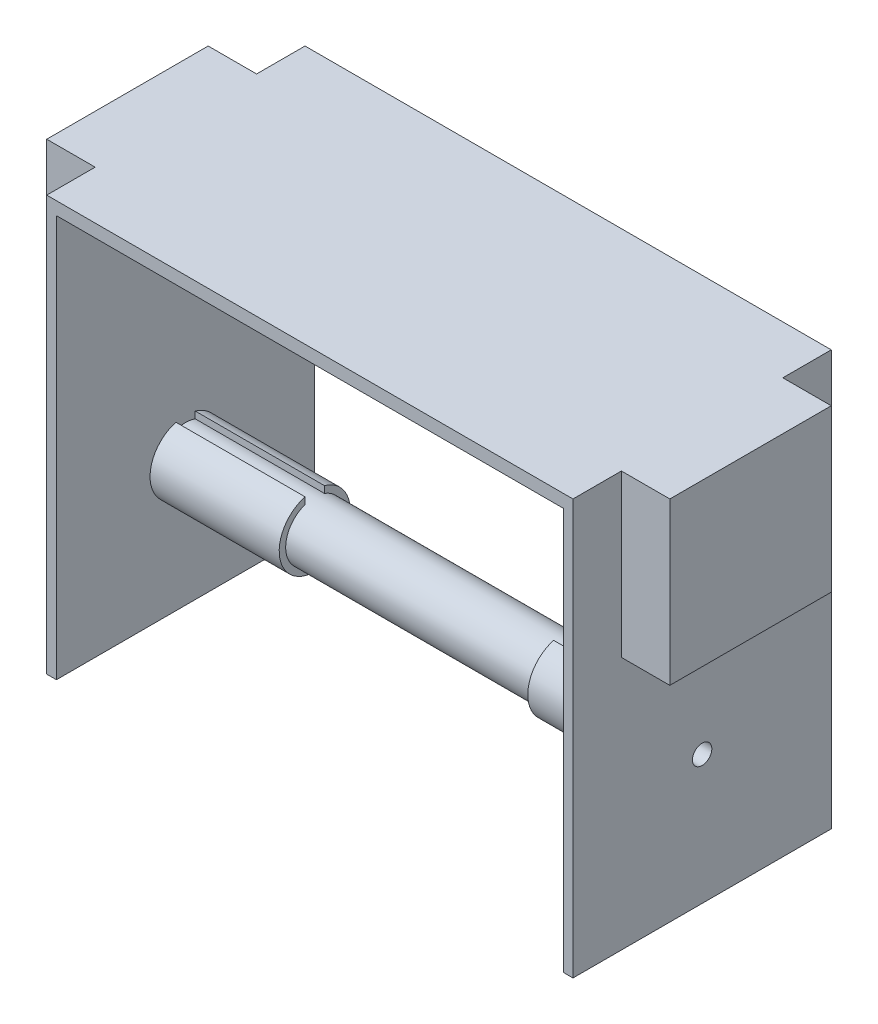
ISO-10303-21;
HEADER;
FILE_DESCRIPTION(('STEP AP214'),'2;1');
FILE_NAME('part.step','',(''),(''),'','','');
FILE_SCHEMA(('AUTOMOTIVE_DESIGN { 1 0 10303 214 1 1 1 1 }'));
ENDSEC;
DATA;
#1=APPLICATION_CONTEXT('core data for automotive mechanical design processes');
#2=APPLICATION_PROTOCOL_DEFINITION('international standard','automotive_design',2000,#1);
#3=PRODUCT_CONTEXT('',#1,'mechanical');
#4=PRODUCT('Part','Part','',(#3));
#5=PRODUCT_RELATED_PRODUCT_CATEGORY('part','',(#4));
#6=PRODUCT_DEFINITION_FORMATION('','',#4);
#7=PRODUCT_DEFINITION_CONTEXT('part definition',#1,'design');
#8=PRODUCT_DEFINITION('design','',#6,#7);
#9=PRODUCT_DEFINITION_SHAPE('','',#8);
#10=(LENGTH_UNIT() NAMED_UNIT(*) SI_UNIT(.MILLI.,.METRE.));
#11=(NAMED_UNIT(*) PLANE_ANGLE_UNIT() SI_UNIT($,.RADIAN.));
#12=(NAMED_UNIT(*) SI_UNIT($,.STERADIAN.) SOLID_ANGLE_UNIT());
#13=UNCERTAINTY_MEASURE_WITH_UNIT(LENGTH_MEASURE(1.E-05),#10,'distance_accuracy_value','');
#14=(GEOMETRIC_REPRESENTATION_CONTEXT(3) GLOBAL_UNCERTAINTY_ASSIGNED_CONTEXT((#13)) GLOBAL_UNIT_ASSIGNED_CONTEXT((#10,
#11,#12)) REPRESENTATION_CONTEXT('',''));
#15=CARTESIAN_POINT('',(0.,0.,0.));
#16=DIRECTION('',(0.,0.,1.));
#17=DIRECTION('',(1.,0.,0.));
#18=AXIS2_PLACEMENT_3D('',#15,#16,#17);
#19=CARTESIAN_POINT('',(80.,0.,0.));
#20=DIRECTION('',(1.,0.,0.));
#21=DIRECTION('',(0.,0.,-1.));
#22=AXIS2_PLACEMENT_3D('',#19,#20,#21);
#23=PLANE('',#22);
#24=DIRECTION('',(0.,0.,1.));
#25=VECTOR('',#24,1.);
#26=CARTESIAN_POINT('',(80.,84.5,0.));
#27=LINE('',#26,#25);
#28=CARTESIAN_POINT('',(80.,84.5,-40.));
#29=VERTEX_POINT('',#28);
#30=CARTESIAN_POINT('',(80.,84.5,40.));
#31=VERTEX_POINT('',#30);
#32=EDGE_CURVE('E56',#29,#31,#27,.T.);
#33=ORIENTED_EDGE('',*,*,#32,.F.);
#34=DIRECTION('',(0.,1.,0.));
#35=VECTOR('',#34,1.);
#36=CARTESIAN_POINT('',(80.,0.,-40.));
#37=LINE('',#36,#35);
#38=CARTESIAN_POINT('',(80.,-40.,-40.));
#39=VERTEX_POINT('',#38);
#40=EDGE_CURVE('E331',#39,#29,#37,.T.);
#41=ORIENTED_EDGE('',*,*,#40,.F.);
#42=DIRECTION('',(0.,0.,-1.));
#43=VECTOR('',#42,1.);
#44=CARTESIAN_POINT('',(80.,-40.,0.));
#45=LINE('',#44,#43);
#46=CARTESIAN_POINT('',(80.,-40.,40.));
#47=VERTEX_POINT('',#46);
#48=EDGE_CURVE('E337',#47,#39,#45,.T.);
#49=ORIENTED_EDGE('',*,*,#48,.F.);
#50=DIRECTION('',(0.,1.,0.));
#51=VECTOR('',#50,1.);
#52=CARTESIAN_POINT('',(80.,0.,40.));
#53=LINE('',#52,#51);
#54=EDGE_CURVE('E347',#47,#31,#53,.T.);
#55=ORIENTED_EDGE('',*,*,#54,.T.);
#56=EDGE_LOOP('',(#33,#41,#49,#55));
#57=FACE_BOUND('',#56,.T.);
#58=CARTESIAN_POINT('',(80.,0.,0.));
#59=DIRECTION('',(1.,0.,0.));
#60=DIRECTION('',(0.,0.,-1.));
#61=AXIS2_PLACEMENT_3D('',#58,#59,#60);
#62=CIRCLE('',#61,9.);
#63=CARTESIAN_POINT('',(80.,8.48528137423857,-3.));
#64=VERTEX_POINT('',#63);
#65=CARTESIAN_POINT('',(80.,8.48528137423857,3.));
#66=VERTEX_POINT('',#65);
#67=EDGE_CURVE('E229',#64,#66,#62,.T.);
#68=ORIENTED_EDGE('',*,*,#67,.T.);
#69=DIRECTION('',(0.,-1.,0.));
#70=VECTOR('',#69,1.);
#71=CARTESIAN_POINT('',(80.,12.,3.));
#72=LINE('',#71,#70);
#73=CARTESIAN_POINT('',(80.,10.5830052442584,3.));
#74=VERTEX_POINT('',#73);
#75=EDGE_CURVE('E438',#74,#66,#72,.T.);
#76=ORIENTED_EDGE('',*,*,#75,.F.);
#77=CARTESIAN_POINT('',(80.,0.,0.));
#78=DIRECTION('',(-1.,0.,0.));
#79=DIRECTION('',(0.,0.,1.));
#80=AXIS2_PLACEMENT_3D('',#77,#78,#79);
#81=CIRCLE('',#80,11.);
#82=CARTESIAN_POINT('',(80.,10.5830052442584,-3.));
#83=VERTEX_POINT('',#82);
#84=EDGE_CURVE('E306',#83,#74,#81,.T.);
#85=ORIENTED_EDGE('',*,*,#84,.F.);
#86=DIRECTION('',(0.,1.,0.));
#87=VECTOR('',#86,1.);
#88=CARTESIAN_POINT('',(80.,12.,-3.));
#89=LINE('',#88,#87);
#90=EDGE_CURVE('E242',#64,#83,#89,.T.);
#91=ORIENTED_EDGE('',*,*,#90,.F.);
#92=EDGE_LOOP('',(#68,#76,#85,#91));
#93=FACE_BOUND('',#92,.T.);
#94=ADVANCED_FACE('F47',(#57,#93),#23,.F.);
#95=CARTESIAN_POINT('',(-77.,0.,0.));
#96=DIRECTION('',(-1.,0.,0.));
#97=DIRECTION('',(0.,0.,1.));
#98=AXIS2_PLACEMENT_3D('',#95,#96,#97);
#99=PLANE('',#98);
#100=DIRECTION('',(0.,1.,0.));
#101=VECTOR('',#100,1.);
#102=CARTESIAN_POINT('',(-77.,88.4852813742386,-40.));
#103=LINE('',#102,#101);
#104=CARTESIAN_POINT('',(-77.,-40.,-40.));
#105=VERTEX_POINT('',#104);
#106=CARTESIAN_POINT('',(-77.,84.5,-40.));
#107=VERTEX_POINT('',#106);
#108=EDGE_CURVE('E256',#105,#107,#103,.T.);
#109=ORIENTED_EDGE('',*,*,#108,.T.);
#110=DIRECTION('',(0.,0.,1.));
#111=VECTOR('',#110,1.);
#112=CARTESIAN_POINT('',(-77.,84.5,0.));
#113=LINE('',#112,#111);
#114=CARTESIAN_POINT('',(-77.,84.5,40.));
#115=VERTEX_POINT('',#114);
#116=EDGE_CURVE('E12',#107,#115,#113,.T.);
#117=ORIENTED_EDGE('',*,*,#116,.T.);
#118=DIRECTION('',(0.,-1.,0.));
#119=VECTOR('',#118,1.);
#120=CARTESIAN_POINT('',(-77.,88.4852813742386,40.));
#121=LINE('',#120,#119);
#122=CARTESIAN_POINT('',(-77.,-40.,40.));
#123=VERTEX_POINT('',#122);
#124=EDGE_CURVE('E259',#115,#123,#121,.T.);
#125=ORIENTED_EDGE('',*,*,#124,.T.);
#126=DIRECTION('',(0.,0.,-1.));
#127=VECTOR('',#126,1.);
#128=CARTESIAN_POINT('',(-77.,-40.,-40.));
#129=LINE('',#128,#127);
#130=EDGE_CURVE('E262',#123,#105,#129,.T.);
#131=ORIENTED_EDGE('',*,*,#130,.T.);
#132=EDGE_LOOP('',(#109,#117,#125,#131));
#133=FACE_BOUND('',#132,.T.);
#134=CARTESIAN_POINT('',(-77.,0.,0.));
#135=DIRECTION('',(1.,0.,0.));
#136=DIRECTION('',(0.,0.,-1.));
#137=AXIS2_PLACEMENT_3D('',#134,#135,#136);
#138=CIRCLE('',#137,9.);
#139=CARTESIAN_POINT('',(-77.,8.48528137423857,-3.));
#140=VERTEX_POINT('',#139);
#141=CARTESIAN_POINT('',(-77.,8.48528137423857,3.));
#142=VERTEX_POINT('',#141);
#143=EDGE_CURVE('E210',#140,#142,#138,.T.);
#144=ORIENTED_EDGE('',*,*,#143,.F.);
#145=DIRECTION('',(0.,-1.,0.));
#146=VECTOR('',#145,1.);
#147=CARTESIAN_POINT('',(-77.,10.5830052442584,-3.));
#148=LINE('',#147,#146);
#149=CARTESIAN_POINT('',(-77.,10.5830052442584,-3.));
#150=VERTEX_POINT('',#149);
#151=EDGE_CURVE('E223',#150,#140,#148,.T.);
#152=ORIENTED_EDGE('',*,*,#151,.F.);
#153=CARTESIAN_POINT('',(-77.,0.,0.));
#154=DIRECTION('',(1.,0.,0.));
#155=DIRECTION('',(0.,0.,-1.));
#156=AXIS2_PLACEMENT_3D('',#153,#154,#155);
#157=CIRCLE('',#156,11.);
#158=CARTESIAN_POINT('',(-77.,10.5830052442584,3.));
#159=VERTEX_POINT('',#158);
#160=EDGE_CURVE('E236',#159,#150,#157,.T.);
#161=ORIENTED_EDGE('',*,*,#160,.F.);
#162=DIRECTION('',(0.,1.,0.));
#163=VECTOR('',#162,1.);
#164=CARTESIAN_POINT('',(-77.,10.5830052442584,3.));
#165=LINE('',#164,#163);
#166=EDGE_CURVE('E226',#142,#159,#165,.T.);
#167=ORIENTED_EDGE('',*,*,#166,.F.);
#168=EDGE_LOOP('',(#144,#152,#161,#167));
#169=FACE_BOUND('',#168,.T.);
#170=ADVANCED_FACE('F222',(#133,#169),#99,.F.);
#171=CARTESIAN_POINT('',(-80.,88.5,-40.));
#172=DIRECTION('',(1.,0.,0.));
#173=DIRECTION('',(0.,0.,-1.));
#174=AXIS2_PLACEMENT_3D('',#171,#172,#173);
#175=PLANE('',#174);
#176=CARTESIAN_POINT('',(-80.,0.,0.));
#177=DIRECTION('',(-1.,0.,0.));
#178=DIRECTION('',(0.,0.,1.));
#179=AXIS2_PLACEMENT_3D('',#176,#177,#178);
#180=CIRCLE('',#179,3.);
#181=CARTESIAN_POINT('',(-80.,0.,3.));
#182=VERTEX_POINT('',#181);
#183=EDGE_CURVE('E512',#182,#182,#180,.T.);
#184=ORIENTED_EDGE('',*,*,#183,.F.);
#185=EDGE_LOOP('',(#184));
#186=FACE_BOUND('',#185,.T.);
#187=DIRECTION('',(0.,1.,0.));
#188=VECTOR('',#187,1.);
#189=CARTESIAN_POINT('',(-80.,38.5,25.));
#190=LINE('',#189,#188);
#191=CARTESIAN_POINT('',(-80.,38.5,25.));
#192=VERTEX_POINT('',#191);
#193=CARTESIAN_POINT('',(-80.,88.5,25.));
#194=VERTEX_POINT('',#193);
#195=EDGE_CURVE('E449',#192,#194,#190,.T.);
#196=ORIENTED_EDGE('',*,*,#195,.F.);
#197=DIRECTION('',(0.,0.,-1.));
#198=VECTOR('',#197,1.);
#199=CARTESIAN_POINT('',(-80.,38.5,-25.));
#200=LINE('',#199,#198);
#201=CARTESIAN_POINT('',(-80.,38.5,-25.));
#202=VERTEX_POINT('',#201);
#203=EDGE_CURVE('E446',#192,#202,#200,.T.);
#204=ORIENTED_EDGE('',*,*,#203,.T.);
#205=DIRECTION('',(0.,1.,0.));
#206=VECTOR('',#205,1.);
#207=CARTESIAN_POINT('',(-80.,38.5,-25.));
#208=LINE('',#207,#206);
#209=CARTESIAN_POINT('',(-80.,88.5,-25.));
#210=VERTEX_POINT('',#209);
#211=EDGE_CURVE('E405',#202,#210,#208,.T.);
#212=ORIENTED_EDGE('',*,*,#211,.T.);
#213=DIRECTION('',(0.,0.,1.));
#214=VECTOR('',#213,1.);
#215=CARTESIAN_POINT('',(-80.,88.5,-40.));
#216=LINE('',#215,#214);
#217=CARTESIAN_POINT('',(-80.,88.5,-40.));
#218=VERTEX_POINT('',#217);
#219=EDGE_CURVE('E277',#218,#210,#216,.T.);
#220=ORIENTED_EDGE('',*,*,#219,.F.);
#221=DIRECTION('',(0.,-1.,0.));
#222=VECTOR('',#221,1.);
#223=CARTESIAN_POINT('',(-80.,88.5,-40.));
#224=LINE('',#223,#222);
#225=CARTESIAN_POINT('',(-80.,-40.,-40.));
#226=VERTEX_POINT('',#225);
#227=EDGE_CURVE('E294',#218,#226,#224,.T.);
#228=ORIENTED_EDGE('',*,*,#227,.T.);
#229=DIRECTION('',(0.,0.,-1.));
#230=VECTOR('',#229,1.);
#231=CARTESIAN_POINT('',(-80.,-40.,-40.));
#232=LINE('',#231,#230);
#233=CARTESIAN_POINT('',(-80.,-40.,40.));
#234=VERTEX_POINT('',#233);
#235=EDGE_CURVE('E255',#234,#226,#232,.T.);
#236=ORIENTED_EDGE('',*,*,#235,.F.);
#237=DIRECTION('',(0.,-1.,0.));
#238=VECTOR('',#237,1.);
#239=CARTESIAN_POINT('',(-80.,88.5,40.));
#240=LINE('',#239,#238);
#241=CARTESIAN_POINT('',(-80.,88.5,40.));
#242=VERTEX_POINT('',#241);
#243=EDGE_CURVE('E303',#242,#234,#240,.T.);
#244=ORIENTED_EDGE('',*,*,#243,.F.);
#245=EDGE_CURVE('E281',#194,#242,#216,.T.);
#246=ORIENTED_EDGE('',*,*,#245,.F.);
#247=EDGE_LOOP('',(#196,#204,#212,#220,#228,#236,#244,#246));
#248=FACE_BOUND('',#247,.T.);
#249=ADVANCED_FACE('F402',(#186,#248),#175,.F.);
#250=CARTESIAN_POINT('',(83.,0.,3.));
#251=DIRECTION('',(0.,0.,-1.));
#252=DIRECTION('',(-1.,0.,0.));
#253=AXIS2_PLACEMENT_3D('',#250,#251,#252);
#254=PLANE('',#253);
#255=DIRECTION('',(1.,0.,0.));
#256=VECTOR('',#255,1.);
#257=CARTESIAN_POINT('',(40.,10.5830052442584,3.));
#258=LINE('',#257,#256);
#259=CARTESIAN_POINT('',(40.,10.5830052442584,3.));
#260=VERTEX_POINT('',#259);
#261=EDGE_CURVE('E321',#260,#74,#258,.T.);
#262=ORIENTED_EDGE('',*,*,#261,.T.);
#263=ORIENTED_EDGE('',*,*,#75,.T.);
#264=DIRECTION('',(-1.,0.,0.));
#265=VECTOR('',#264,1.);
#266=CARTESIAN_POINT('',(83.,8.48528137423857,3.));
#267=LINE('',#266,#265);
#268=CARTESIAN_POINT('',(40.,8.48528137423857,3.));
#269=VERTEX_POINT('',#268);
#270=EDGE_CURVE('E358',#66,#269,#267,.T.);
#271=ORIENTED_EDGE('',*,*,#270,.T.);
#272=DIRECTION('',(0.,-1.,0.));
#273=VECTOR('',#272,1.);
#274=CARTESIAN_POINT('',(40.,8.48528137423857,3.));
#275=LINE('',#274,#273);
#276=EDGE_CURVE('E317',#260,#269,#275,.T.);
#277=ORIENTED_EDGE('',*,*,#276,.F.);
#278=EDGE_LOOP('',(#262,#263,#271,#277));
#279=FACE_BOUND('',#278,.T.);
#280=ADVANCED_FACE('F49',(#279),#254,.T.);
#281=CARTESIAN_POINT('',(83.,0.,-3.));
#282=DIRECTION('',(0.,0.,-1.));
#283=DIRECTION('',(-1.,0.,0.));
#284=AXIS2_PLACEMENT_3D('',#281,#282,#283);
#285=PLANE('',#284);
#286=ORIENTED_EDGE('',*,*,#90,.T.);
#287=DIRECTION('',(1.,0.,0.));
#288=VECTOR('',#287,1.);
#289=CARTESIAN_POINT('',(40.,10.5830052442584,-3.));
#290=LINE('',#289,#288);
#291=CARTESIAN_POINT('',(40.,10.5830052442584,-3.));
#292=VERTEX_POINT('',#291);
#293=EDGE_CURVE('E327',#292,#83,#290,.T.);
#294=ORIENTED_EDGE('',*,*,#293,.F.);
#295=DIRECTION('',(0.,1.,0.));
#296=VECTOR('',#295,1.);
#297=CARTESIAN_POINT('',(40.,10.5830052442584,-3.));
#298=LINE('',#297,#296);
#299=CARTESIAN_POINT('',(40.,8.48528137423857,-3.));
#300=VERTEX_POINT('',#299);
#301=EDGE_CURVE('E311',#300,#292,#298,.T.);
#302=ORIENTED_EDGE('',*,*,#301,.F.);
#303=DIRECTION('',(-1.,0.,0.));
#304=VECTOR('',#303,1.);
#305=CARTESIAN_POINT('',(83.,8.48528137423857,-3.));
#306=LINE('',#305,#304);
#307=EDGE_CURVE('E343',#64,#300,#306,.T.);
#308=ORIENTED_EDGE('',*,*,#307,.F.);
#309=EDGE_LOOP('',(#286,#294,#302,#308));
#310=FACE_BOUND('',#309,.T.);
#311=ADVANCED_FACE('F561',(#310),#285,.F.);
#312=CARTESIAN_POINT('',(0.,84.5,0.));
#313=DIRECTION('',(0.,1.,0.));
#314=DIRECTION('',(0.,0.,1.));
#315=AXIS2_PLACEMENT_3D('',#312,#313,#314);
#316=PLANE('',#315);
#317=ORIENTED_EDGE('',*,*,#116,.F.);
#318=DIRECTION('',(-1.,0.,0.));
#319=VECTOR('',#318,1.);
#320=CARTESIAN_POINT('',(-80.,84.5,-40.));
#321=LINE('',#320,#319);
#322=EDGE_CURVE('E297',#29,#107,#321,.T.);
#323=ORIENTED_EDGE('',*,*,#322,.F.);
#324=ORIENTED_EDGE('',*,*,#32,.T.);
#325=DIRECTION('',(1.,0.,0.));
#326=VECTOR('',#325,1.);
#327=CARTESIAN_POINT('',(-80.,84.5,40.));
#328=LINE('',#327,#326);
#329=EDGE_CURVE('E276',#115,#31,#328,.T.);
#330=ORIENTED_EDGE('',*,*,#329,.F.);
#331=EDGE_LOOP('',(#317,#323,#324,#330));
#332=FACE_BOUND('',#331,.T.);
#333=ADVANCED_FACE('F371',(#332),#316,.F.);
#334=CARTESIAN_POINT('',(83.,0.,-40.));
#335=DIRECTION('',(0.,0.,1.));
#336=DIRECTION('',(1.,0.,0.));
#337=AXIS2_PLACEMENT_3D('',#334,#335,#336);
#338=PLANE('',#337);
#339=ORIENTED_EDGE('',*,*,#322,.T.);
#340=ORIENTED_EDGE('',*,*,#108,.F.);
#341=DIRECTION('',(-1.,0.,0.));
#342=VECTOR('',#341,1.);
#343=CARTESIAN_POINT('',(-77.,-40.,-40.));
#344=LINE('',#343,#342);
#345=EDGE_CURVE('E265',#105,#226,#344,.T.);
#346=ORIENTED_EDGE('',*,*,#345,.T.);
#347=ORIENTED_EDGE('',*,*,#227,.F.);
#348=DIRECTION('',(-1.,0.,0.));
#349=VECTOR('',#348,1.);
#350=CARTESIAN_POINT('',(-80.,88.5,-40.));
#351=LINE('',#350,#349);
#352=CARTESIAN_POINT('',(83.,88.5,-40.));
#353=VERTEX_POINT('',#352);
#354=EDGE_CURVE('E291',#353,#218,#351,.T.);
#355=ORIENTED_EDGE('',*,*,#354,.F.);
#356=DIRECTION('',(0.,1.,0.));
#357=VECTOR('',#356,1.);
#358=CARTESIAN_POINT('',(83.,0.,-40.));
#359=LINE('',#358,#357);
#360=CARTESIAN_POINT('',(83.,-40.,-40.));
#361=VERTEX_POINT('',#360);
#362=EDGE_CURVE('E332',#361,#353,#359,.T.);
#363=ORIENTED_EDGE('',*,*,#362,.F.);
#364=DIRECTION('',(-1.,0.,0.));
#365=VECTOR('',#364,1.);
#366=CARTESIAN_POINT('',(83.,-40.,-40.));
#367=LINE('',#366,#365);
#368=EDGE_CURVE('E353',#361,#39,#367,.T.);
#369=ORIENTED_EDGE('',*,*,#368,.T.);
#370=ORIENTED_EDGE('',*,*,#40,.T.);
#371=EDGE_LOOP('',(#339,#340,#346,#347,#355,#363,#369,#370));
#372=FACE_BOUND('',#371,.T.);
#373=ADVANCED_FACE('F378',(#372),#338,.F.);
#374=CARTESIAN_POINT('',(83.,0.,40.));
#375=DIRECTION('',(0.,0.,1.));
#376=DIRECTION('',(1.,0.,0.));
#377=AXIS2_PLACEMENT_3D('',#374,#375,#376);
#378=PLANE('',#377);
#379=ORIENTED_EDGE('',*,*,#124,.F.);
#380=ORIENTED_EDGE('',*,*,#329,.T.);
#381=ORIENTED_EDGE('',*,*,#54,.F.);
#382=DIRECTION('',(-1.,0.,0.));
#383=VECTOR('',#382,1.);
#384=CARTESIAN_POINT('',(83.,-40.,40.));
#385=LINE('',#384,#383);
#386=CARTESIAN_POINT('',(83.,-40.,40.));
#387=VERTEX_POINT('',#386);
#388=EDGE_CURVE('E357',#387,#47,#385,.T.);
#389=ORIENTED_EDGE('',*,*,#388,.F.);
#390=DIRECTION('',(0.,1.,0.));
#391=VECTOR('',#390,1.);
#392=CARTESIAN_POINT('',(83.,0.,40.));
#393=LINE('',#392,#391);
#394=CARTESIAN_POINT('',(83.,88.5,40.));
#395=VERTEX_POINT('',#394);
#396=EDGE_CURVE('E336',#387,#395,#393,.T.);
#397=ORIENTED_EDGE('',*,*,#396,.T.);
#398=DIRECTION('',(1.,0.,0.));
#399=VECTOR('',#398,1.);
#400=CARTESIAN_POINT('',(-80.,88.5,40.));
#401=LINE('',#400,#399);
#402=EDGE_CURVE('E280',#242,#395,#401,.T.);
#403=ORIENTED_EDGE('',*,*,#402,.F.);
#404=ORIENTED_EDGE('',*,*,#243,.T.);
#405=DIRECTION('',(-1.,0.,0.));
#406=VECTOR('',#405,1.);
#407=CARTESIAN_POINT('',(-77.,-40.,40.));
#408=LINE('',#407,#406);
#409=EDGE_CURVE('E272',#123,#234,#408,.T.);
#410=ORIENTED_EDGE('',*,*,#409,.F.);
#411=EDGE_LOOP('',(#379,#380,#381,#389,#397,#403,#404,#410));
#412=FACE_BOUND('',#411,.T.);
#413=ADVANCED_FACE('F389',(#412),#378,.T.);
#414=CARTESIAN_POINT('',(83.,-40.,0.));
#415=DIRECTION('',(0.,1.,0.));
#416=DIRECTION('',(0.,0.,1.));
#417=AXIS2_PLACEMENT_3D('',#414,#415,#416);
#418=PLANE('',#417);
#419=ORIENTED_EDGE('',*,*,#48,.T.);
#420=ORIENTED_EDGE('',*,*,#368,.F.);
#421=DIRECTION('',(0.,0.,-1.));
#422=VECTOR('',#421,1.);
#423=CARTESIAN_POINT('',(83.,-40.,0.));
#424=LINE('',#423,#422);
#425=EDGE_CURVE('E340',#387,#361,#424,.T.);
#426=ORIENTED_EDGE('',*,*,#425,.F.);
#427=ORIENTED_EDGE('',*,*,#388,.T.);
#428=EDGE_LOOP('',(#419,#420,#426,#427));
#429=FACE_BOUND('',#428,.T.);
#430=ADVANCED_FACE('F385',(#429),#418,.F.);
#431=CARTESIAN_POINT('',(83.,0.,0.));
#432=DIRECTION('',(1.,0.,0.));
#433=DIRECTION('',(0.,0.,-1.));
#434=AXIS2_PLACEMENT_3D('',#431,#432,#433);
#435=PLANE('',#434);
#436=CARTESIAN_POINT('',(83.,0.,0.));
#437=DIRECTION('',(1.,0.,0.));
#438=DIRECTION('',(0.,0.,-1.));
#439=AXIS2_PLACEMENT_3D('',#436,#437,#438);
#440=CIRCLE('',#439,3.00000000000001);
#441=CARTESIAN_POINT('',(83.,0.,-3.00000000000001));
#442=VERTEX_POINT('',#441);
#443=EDGE_CURVE('E520',#442,#442,#440,.T.);
#444=ORIENTED_EDGE('',*,*,#443,.F.);
#445=EDGE_LOOP('',(#444));
#446=FACE_BOUND('',#445,.T.);
#447=DIRECTION('',(0.,1.,0.));
#448=VECTOR('',#447,1.);
#449=CARTESIAN_POINT('',(83.,38.5,-25.));
#450=LINE('',#449,#448);
#451=CARTESIAN_POINT('',(83.,38.5,-25.));
#452=VERTEX_POINT('',#451);
#453=CARTESIAN_POINT('',(83.,88.5,-25.));
#454=VERTEX_POINT('',#453);
#455=EDGE_CURVE('E475',#452,#454,#450,.T.);
#456=ORIENTED_EDGE('',*,*,#455,.F.);
#457=DIRECTION('',(0.,0.,1.));
#458=VECTOR('',#457,1.);
#459=CARTESIAN_POINT('',(83.,38.5,-25.));
#460=LINE('',#459,#458);
#461=CARTESIAN_POINT('',(83.,38.5,25.));
#462=VERTEX_POINT('',#461);
#463=EDGE_CURVE('E502',#452,#462,#460,.T.);
#464=ORIENTED_EDGE('',*,*,#463,.T.);
#465=DIRECTION('',(0.,1.,0.));
#466=VECTOR('',#465,1.);
#467=CARTESIAN_POINT('',(83.,38.5,25.));
#468=LINE('',#467,#466);
#469=CARTESIAN_POINT('',(83.,88.5,25.));
#470=VERTEX_POINT('',#469);
#471=EDGE_CURVE('E478',#462,#470,#468,.T.);
#472=ORIENTED_EDGE('',*,*,#471,.T.);
#473=DIRECTION('',(0.,0.,-1.));
#474=VECTOR('',#473,1.);
#475=CARTESIAN_POINT('',(83.,88.5,-40.));
#476=LINE('',#475,#474);
#477=EDGE_CURVE('E287',#395,#470,#476,.T.);
#478=ORIENTED_EDGE('',*,*,#477,.F.);
#479=ORIENTED_EDGE('',*,*,#396,.F.);
#480=ORIENTED_EDGE('',*,*,#425,.T.);
#481=ORIENTED_EDGE('',*,*,#362,.T.);
#482=EDGE_CURVE('E286',#454,#353,#476,.T.);
#483=ORIENTED_EDGE('',*,*,#482,.F.);
#484=EDGE_LOOP('',(#456,#464,#472,#478,#479,#480,#481,#483));
#485=FACE_BOUND('',#484,.T.);
#486=ADVANCED_FACE('F417',(#446,#485),#435,.T.);
#487=CARTESIAN_POINT('',(40.,0.,0.));
#488=DIRECTION('',(1.,0.,0.));
#489=DIRECTION('',(0.,0.,-1.));
#490=AXIS2_PLACEMENT_3D('',#487,#488,#489);
#491=CYLINDRICAL_SURFACE('',#490,11.);
#492=ORIENTED_EDGE('',*,*,#84,.T.);
#493=ORIENTED_EDGE('',*,*,#261,.F.);
#494=CARTESIAN_POINT('',(40.,0.,0.));
#495=DIRECTION('',(-1.,0.,0.));
#496=DIRECTION('',(0.,0.,1.));
#497=AXIS2_PLACEMENT_3D('',#494,#495,#496);
#498=CIRCLE('',#497,11.);
#499=EDGE_CURVE('E314',#292,#260,#498,.T.);
#500=ORIENTED_EDGE('',*,*,#499,.F.);
#501=ORIENTED_EDGE('',*,*,#293,.T.);
#502=EDGE_LOOP('',(#492,#493,#500,#501));
#503=FACE_BOUND('',#502,.T.);
#504=ADVANCED_FACE('F538',(#503),#491,.T.);
#505=CARTESIAN_POINT('',(40.,0.,0.));
#506=DIRECTION('',(-1.,0.,0.));
#507=DIRECTION('',(0.,0.,1.));
#508=AXIS2_PLACEMENT_3D('',#505,#506,#507);
#509=PLANE('',#508);
#510=CARTESIAN_POINT('',(40.,0.,0.));
#511=DIRECTION('',(1.,0.,0.));
#512=DIRECTION('',(0.,0.,1.));
#513=AXIS2_PLACEMENT_3D('',#510,#511,#512);
#514=CIRCLE('',#513,9.);
#515=EDGE_CURVE('E307',#269,#300,#514,.T.);
#516=ORIENTED_EDGE('',*,*,#515,.T.);
#517=ORIENTED_EDGE('',*,*,#301,.T.);
#518=ORIENTED_EDGE('',*,*,#499,.T.);
#519=ORIENTED_EDGE('',*,*,#276,.T.);
#520=EDGE_LOOP('',(#516,#517,#518,#519));
#521=FACE_BOUND('',#520,.T.);
#522=ADVANCED_FACE('F545',(#521),#509,.T.);
#523=CARTESIAN_POINT('',(0.,88.5,0.));
#524=DIRECTION('',(0.,1.,0.));
#525=DIRECTION('',(0.,0.,1.));
#526=AXIS2_PLACEMENT_3D('',#523,#524,#525);
#527=PLANE('',#526);
#528=ORIENTED_EDGE('',*,*,#219,.T.);
#529=DIRECTION('',(-1.,0.,0.));
#530=VECTOR('',#529,1.);
#531=CARTESIAN_POINT('',(-95.,88.5,-25.));
#532=LINE('',#531,#530);
#533=CARTESIAN_POINT('',(-95.,88.5,-25.));
#534=VERTEX_POINT('',#533);
#535=EDGE_CURVE('E71',#210,#534,#532,.T.);
#536=ORIENTED_EDGE('',*,*,#535,.T.);
#537=DIRECTION('',(0.,0.,1.));
#538=VECTOR('',#537,1.);
#539=CARTESIAN_POINT('',(-95.,88.5,25.));
#540=LINE('',#539,#538);
#541=CARTESIAN_POINT('',(-95.,88.5,25.));
#542=VERTEX_POINT('',#541);
#543=EDGE_CURVE('E457',#534,#542,#540,.T.);
#544=ORIENTED_EDGE('',*,*,#543,.T.);
#545=DIRECTION('',(1.,0.,0.));
#546=VECTOR('',#545,1.);
#547=CARTESIAN_POINT('',(-95.,88.5,25.));
#548=LINE('',#547,#546);
#549=EDGE_CURVE('E422',#542,#194,#548,.T.);
#550=ORIENTED_EDGE('',*,*,#549,.T.);
#551=ORIENTED_EDGE('',*,*,#245,.T.);
#552=ORIENTED_EDGE('',*,*,#402,.T.);
#553=ORIENTED_EDGE('',*,*,#477,.T.);
#554=DIRECTION('',(1.,0.,0.));
#555=VECTOR('',#554,1.);
#556=CARTESIAN_POINT('',(98.,88.5,25.));
#557=LINE('',#556,#555);
#558=CARTESIAN_POINT('',(98.,88.5,25.));
#559=VERTEX_POINT('',#558);
#560=EDGE_CURVE('E63',#470,#559,#557,.T.);
#561=ORIENTED_EDGE('',*,*,#560,.T.);
#562=DIRECTION('',(0.,0.,-1.));
#563=VECTOR('',#562,1.);
#564=CARTESIAN_POINT('',(98.,88.5,25.));
#565=LINE('',#564,#563);
#566=CARTESIAN_POINT('',(98.,88.5,-25.));
#567=VERTEX_POINT('',#566);
#568=EDGE_CURVE('E487',#559,#567,#565,.T.);
#569=ORIENTED_EDGE('',*,*,#568,.T.);
#570=DIRECTION('',(-1.,0.,0.));
#571=VECTOR('',#570,1.);
#572=CARTESIAN_POINT('',(98.,88.5,-25.));
#573=LINE('',#572,#571);
#574=EDGE_CURVE('E413',#567,#454,#573,.T.);
#575=ORIENTED_EDGE('',*,*,#574,.T.);
#576=ORIENTED_EDGE('',*,*,#482,.T.);
#577=ORIENTED_EDGE('',*,*,#354,.T.);
#578=EDGE_LOOP('',(#528,#536,#544,#550,#551,#552,#553,#561,#569,#575,#576,#577));
#579=FACE_BOUND('',#578,.T.);
#580=ADVANCED_FACE('F407',(#579),#527,.T.);
#581=CARTESIAN_POINT('',(-77.,-40.,-40.));
#582=DIRECTION('',(0.,1.,0.));
#583=DIRECTION('',(0.,0.,1.));
#584=AXIS2_PLACEMENT_3D('',#581,#582,#583);
#585=PLANE('',#584);
#586=ORIENTED_EDGE('',*,*,#235,.T.);
#587=ORIENTED_EDGE('',*,*,#345,.F.);
#588=ORIENTED_EDGE('',*,*,#130,.F.);
#589=ORIENTED_EDGE('',*,*,#409,.T.);
#590=EDGE_LOOP('',(#586,#587,#588,#589));
#591=FACE_BOUND('',#590,.T.);
#592=ADVANCED_FACE('F397',(#591),#585,.F.);
#593=CARTESIAN_POINT('',(-37.,0.,0.));
#594=DIRECTION('',(-1.,0.,0.));
#595=DIRECTION('',(0.,0.,1.));
#596=AXIS2_PLACEMENT_3D('',#593,#594,#595);
#597=CYLINDRICAL_SURFACE('',#596,11.);
#598=ORIENTED_EDGE('',*,*,#160,.T.);
#599=DIRECTION('',(-1.,0.,0.));
#600=VECTOR('',#599,1.);
#601=CARTESIAN_POINT('',(-37.,10.5830052442584,-3.));
#602=LINE('',#601,#600);
#603=CARTESIAN_POINT('',(-37.,10.5830052442584,-3.));
#604=VERTEX_POINT('',#603);
#605=EDGE_CURVE('E218',#604,#150,#602,.T.);
#606=ORIENTED_EDGE('',*,*,#605,.F.);
#607=CARTESIAN_POINT('',(-37.,0.,0.));
#608=DIRECTION('',(1.,0.,0.));
#609=DIRECTION('',(0.,0.,-1.));
#610=AXIS2_PLACEMENT_3D('',#607,#608,#609);
#611=CIRCLE('',#610,11.);
#612=CARTESIAN_POINT('',(-37.,10.5830052442584,3.));
#613=VERTEX_POINT('',#612);
#614=EDGE_CURVE('E240',#613,#604,#611,.T.);
#615=ORIENTED_EDGE('',*,*,#614,.F.);
#616=DIRECTION('',(-1.,0.,0.));
#617=VECTOR('',#616,1.);
#618=CARTESIAN_POINT('',(-37.,10.5830052442584,3.));
#619=LINE('',#618,#617);
#620=EDGE_CURVE('E246',#613,#159,#619,.T.);
#621=ORIENTED_EDGE('',*,*,#620,.T.);
#622=EDGE_LOOP('',(#598,#606,#615,#621));
#623=FACE_BOUND('',#622,.T.);
#624=ADVANCED_FACE('F632',(#623),#597,.T.);
#625=CARTESIAN_POINT('',(-37.,10.5830052442584,-3.));
#626=DIRECTION('',(0.,0.,-1.));
#627=DIRECTION('',(-1.,0.,0.));
#628=AXIS2_PLACEMENT_3D('',#625,#626,#627);
#629=PLANE('',#628);
#630=ORIENTED_EDGE('',*,*,#151,.T.);
#631=DIRECTION('',(-1.,0.,0.));
#632=VECTOR('',#631,1.);
#633=CARTESIAN_POINT('',(-37.,8.48528137423857,-3.));
#634=LINE('',#633,#632);
#635=CARTESIAN_POINT('',(-37.,8.48528137423857,-3.));
#636=VERTEX_POINT('',#635);
#637=EDGE_CURVE('E207',#636,#140,#634,.T.);
#638=ORIENTED_EDGE('',*,*,#637,.F.);
#639=DIRECTION('',(0.,-1.,0.));
#640=VECTOR('',#639,1.);
#641=CARTESIAN_POINT('',(-37.,10.5830052442584,-3.));
#642=LINE('',#641,#640);
#643=EDGE_CURVE('E427',#604,#636,#642,.T.);
#644=ORIENTED_EDGE('',*,*,#643,.F.);
#645=ORIENTED_EDGE('',*,*,#605,.T.);
#646=EDGE_LOOP('',(#630,#638,#644,#645));
#647=FACE_BOUND('',#646,.T.);
#648=ADVANCED_FACE('F232',(#647),#629,.F.);
#649=CARTESIAN_POINT('',(-37.,10.5830052442584,3.));
#650=DIRECTION('',(0.,0.,1.));
#651=DIRECTION('',(1.,0.,0.));
#652=AXIS2_PLACEMENT_3D('',#649,#650,#651);
#653=PLANE('',#652);
#654=ORIENTED_EDGE('',*,*,#166,.T.);
#655=ORIENTED_EDGE('',*,*,#620,.F.);
#656=DIRECTION('',(0.,1.,0.));
#657=VECTOR('',#656,1.);
#658=CARTESIAN_POINT('',(-37.,10.5830052442584,3.));
#659=LINE('',#658,#657);
#660=CARTESIAN_POINT('',(-37.,8.48528137423857,3.));
#661=VERTEX_POINT('',#660);
#662=EDGE_CURVE('E250',#661,#613,#659,.T.);
#663=ORIENTED_EDGE('',*,*,#662,.F.);
#664=DIRECTION('',(-1.,0.,0.));
#665=VECTOR('',#664,1.);
#666=CARTESIAN_POINT('',(-37.,8.48528137423857,3.));
#667=LINE('',#666,#665);
#668=EDGE_CURVE('E219',#661,#142,#667,.T.);
#669=ORIENTED_EDGE('',*,*,#668,.T.);
#670=EDGE_LOOP('',(#654,#655,#663,#669));
#671=FACE_BOUND('',#670,.T.);
#672=ADVANCED_FACE('F626',(#671),#653,.F.);
#673=CARTESIAN_POINT('',(-37.,0.,0.));
#674=DIRECTION('',(1.,0.,0.));
#675=DIRECTION('',(0.,0.,-1.));
#676=AXIS2_PLACEMENT_3D('',#673,#674,#675);
#677=PLANE('',#676);
#678=ORIENTED_EDGE('',*,*,#614,.T.);
#679=ORIENTED_EDGE('',*,*,#643,.T.);
#680=CARTESIAN_POINT('',(-37.,0.,0.));
#681=DIRECTION('',(-1.,0.,0.));
#682=DIRECTION('',(0.,0.,-1.));
#683=AXIS2_PLACEMENT_3D('',#680,#681,#682);
#684=CIRCLE('',#683,9.);
#685=EDGE_CURVE('E213',#636,#661,#684,.T.);
#686=ORIENTED_EDGE('',*,*,#685,.T.);
#687=ORIENTED_EDGE('',*,*,#662,.T.);
#688=EDGE_LOOP('',(#678,#679,#686,#687));
#689=FACE_BOUND('',#688,.T.);
#690=ADVANCED_FACE('F623',(#689),#677,.T.);
#691=CARTESIAN_POINT('',(-95.,38.5,-25.));
#692=DIRECTION('',(0.,0.,-1.));
#693=DIRECTION('',(-1.,0.,0.));
#694=AXIS2_PLACEMENT_3D('',#691,#692,#693);
#695=PLANE('',#694);
#696=ORIENTED_EDGE('',*,*,#535,.F.);
#697=ORIENTED_EDGE('',*,*,#211,.F.);
#698=DIRECTION('',(-1.,0.,0.));
#699=VECTOR('',#698,1.);
#700=CARTESIAN_POINT('',(-95.,38.5,-25.));
#701=LINE('',#700,#699);
#702=CARTESIAN_POINT('',(-95.,38.5,-25.));
#703=VERTEX_POINT('',#702);
#704=EDGE_CURVE('E456',#202,#703,#701,.T.);
#705=ORIENTED_EDGE('',*,*,#704,.T.);
#706=DIRECTION('',(0.,1.,0.));
#707=VECTOR('',#706,1.);
#708=CARTESIAN_POINT('',(-95.,38.5,-25.));
#709=LINE('',#708,#707);
#710=EDGE_CURVE('E442',#703,#534,#709,.T.);
#711=ORIENTED_EDGE('',*,*,#710,.T.);
#712=EDGE_LOOP('',(#696,#697,#705,#711));
#713=FACE_BOUND('',#712,.T.);
#714=ADVANCED_FACE('F616',(#713),#695,.T.);
#715=CARTESIAN_POINT('',(-95.,38.5,25.));
#716=DIRECTION('',(0.,0.,1.));
#717=DIRECTION('',(1.,0.,0.));
#718=AXIS2_PLACEMENT_3D('',#715,#716,#717);
#719=PLANE('',#718);
#720=ORIENTED_EDGE('',*,*,#549,.F.);
#721=DIRECTION('',(0.,1.,0.));
#722=VECTOR('',#721,1.);
#723=CARTESIAN_POINT('',(-95.,38.5,25.));
#724=LINE('',#723,#722);
#725=CARTESIAN_POINT('',(-95.,38.5,25.));
#726=VERTEX_POINT('',#725);
#727=EDGE_CURVE('E445',#726,#542,#724,.T.);
#728=ORIENTED_EDGE('',*,*,#727,.F.);
#729=DIRECTION('',(1.,0.,0.));
#730=VECTOR('',#729,1.);
#731=CARTESIAN_POINT('',(-95.,38.5,25.));
#732=LINE('',#731,#730);
#733=EDGE_CURVE('E465',#726,#192,#732,.T.);
#734=ORIENTED_EDGE('',*,*,#733,.T.);
#735=ORIENTED_EDGE('',*,*,#195,.T.);
#736=EDGE_LOOP('',(#720,#728,#734,#735));
#737=FACE_BOUND('',#736,.T.);
#738=ADVANCED_FACE('F613',(#737),#719,.T.);
#739=CARTESIAN_POINT('',(-95.,38.5,25.));
#740=DIRECTION('',(-1.,0.,0.));
#741=DIRECTION('',(0.,0.,1.));
#742=AXIS2_PLACEMENT_3D('',#739,#740,#741);
#743=PLANE('',#742);
#744=ORIENTED_EDGE('',*,*,#543,.F.);
#745=ORIENTED_EDGE('',*,*,#710,.F.);
#746=DIRECTION('',(0.,0.,1.));
#747=VECTOR('',#746,1.);
#748=CARTESIAN_POINT('',(-95.,38.5,25.));
#749=LINE('',#748,#747);
#750=EDGE_CURVE('E468',#703,#726,#749,.T.);
#751=ORIENTED_EDGE('',*,*,#750,.T.);
#752=ORIENTED_EDGE('',*,*,#727,.T.);
#753=EDGE_LOOP('',(#744,#745,#751,#752));
#754=FACE_BOUND('',#753,.T.);
#755=ADVANCED_FACE('F611',(#754),#743,.T.);
#756=CARTESIAN_POINT('',(0.,38.5,0.));
#757=DIRECTION('',(0.,-1.,0.));
#758=DIRECTION('',(0.,0.,-1.));
#759=AXIS2_PLACEMENT_3D('',#756,#757,#758);
#760=PLANE('',#759);
#761=ORIENTED_EDGE('',*,*,#704,.F.);
#762=ORIENTED_EDGE('',*,*,#203,.F.);
#763=ORIENTED_EDGE('',*,*,#733,.F.);
#764=ORIENTED_EDGE('',*,*,#750,.F.);
#765=EDGE_LOOP('',(#761,#762,#763,#764));
#766=FACE_BOUND('',#765,.T.);
#767=ADVANCED_FACE('F607',(#766),#760,.T.);
#768=CARTESIAN_POINT('',(98.,38.5,-25.));
#769=DIRECTION('',(0.,0.,-1.));
#770=DIRECTION('',(-1.,0.,0.));
#771=AXIS2_PLACEMENT_3D('',#768,#769,#770);
#772=PLANE('',#771);
#773=ORIENTED_EDGE('',*,*,#574,.F.);
#774=DIRECTION('',(0.,1.,0.));
#775=VECTOR('',#774,1.);
#776=CARTESIAN_POINT('',(98.,38.5,-25.));
#777=LINE('',#776,#775);
#778=CARTESIAN_POINT('',(98.,38.5,-25.));
#779=VERTEX_POINT('',#778);
#780=EDGE_CURVE('E462',#779,#567,#777,.T.);
#781=ORIENTED_EDGE('',*,*,#780,.F.);
#782=DIRECTION('',(-1.,0.,0.));
#783=VECTOR('',#782,1.);
#784=CARTESIAN_POINT('',(98.,38.5,-25.));
#785=LINE('',#784,#783);
#786=EDGE_CURVE('E490',#779,#452,#785,.T.);
#787=ORIENTED_EDGE('',*,*,#786,.T.);
#788=ORIENTED_EDGE('',*,*,#455,.T.);
#789=EDGE_LOOP('',(#773,#781,#787,#788));
#790=FACE_BOUND('',#789,.T.);
#791=ADVANCED_FACE('F601',(#790),#772,.T.);
#792=CARTESIAN_POINT('',(98.,38.5,25.));
#793=DIRECTION('',(1.,0.,0.));
#794=DIRECTION('',(0.,0.,-1.));
#795=AXIS2_PLACEMENT_3D('',#792,#793,#794);
#796=PLANE('',#795);
#797=ORIENTED_EDGE('',*,*,#568,.F.);
#798=DIRECTION('',(0.,1.,0.));
#799=VECTOR('',#798,1.);
#800=CARTESIAN_POINT('',(98.,38.5,25.));
#801=LINE('',#800,#799);
#802=CARTESIAN_POINT('',(98.,38.5,25.));
#803=VERTEX_POINT('',#802);
#804=EDGE_CURVE('E482',#803,#559,#801,.T.);
#805=ORIENTED_EDGE('',*,*,#804,.F.);
#806=DIRECTION('',(0.,0.,-1.));
#807=VECTOR('',#806,1.);
#808=CARTESIAN_POINT('',(98.,38.5,25.));
#809=LINE('',#808,#807);
#810=EDGE_CURVE('E479',#803,#779,#809,.T.);
#811=ORIENTED_EDGE('',*,*,#810,.T.);
#812=ORIENTED_EDGE('',*,*,#780,.T.);
#813=EDGE_LOOP('',(#797,#805,#811,#812));
#814=FACE_BOUND('',#813,.T.);
#815=ADVANCED_FACE('F598',(#814),#796,.T.);
#816=CARTESIAN_POINT('',(98.,38.5,25.));
#817=DIRECTION('',(0.,0.,1.));
#818=DIRECTION('',(1.,0.,0.));
#819=AXIS2_PLACEMENT_3D('',#816,#817,#818);
#820=PLANE('',#819);
#821=ORIENTED_EDGE('',*,*,#560,.F.);
#822=ORIENTED_EDGE('',*,*,#471,.F.);
#823=DIRECTION('',(1.,0.,0.));
#824=VECTOR('',#823,1.);
#825=CARTESIAN_POINT('',(98.,38.5,25.));
#826=LINE('',#825,#824);
#827=EDGE_CURVE('E498',#462,#803,#826,.T.);
#828=ORIENTED_EDGE('',*,*,#827,.T.);
#829=ORIENTED_EDGE('',*,*,#804,.T.);
#830=EDGE_LOOP('',(#821,#822,#828,#829));
#831=FACE_BOUND('',#830,.T.);
#832=ADVANCED_FACE('F593',(#831),#820,.T.);
#833=CARTESIAN_POINT('',(0.,38.5,0.));
#834=DIRECTION('',(0.,1.,0.));
#835=DIRECTION('',(0.,0.,1.));
#836=AXIS2_PLACEMENT_3D('',#833,#834,#835);
#837=PLANE('',#836);
#838=ORIENTED_EDGE('',*,*,#786,.F.);
#839=ORIENTED_EDGE('',*,*,#810,.F.);
#840=ORIENTED_EDGE('',*,*,#827,.F.);
#841=ORIENTED_EDGE('',*,*,#463,.F.);
#842=EDGE_LOOP('',(#838,#839,#840,#841));
#843=FACE_BOUND('',#842,.T.);
#844=ADVANCED_FACE('F584',(#843),#837,.F.);
#845=CARTESIAN_POINT('',(105.455844122716,0.,0.));
#846=DIRECTION('',(-1.,0.,0.));
#847=DIRECTION('',(0.,0.,1.));
#848=AXIS2_PLACEMENT_3D('',#845,#846,#847);
#849=CYLINDRICAL_SURFACE('',#848,9.);
#850=ORIENTED_EDGE('',*,*,#270,.F.);
#851=ORIENTED_EDGE('',*,*,#67,.F.);
#852=ORIENTED_EDGE('',*,*,#307,.T.);
#853=ORIENTED_EDGE('',*,*,#515,.F.);
#854=EDGE_LOOP('',(#850,#851,#852,#853));
#855=FACE_BOUND('',#854,.T.);
#856=ORIENTED_EDGE('',*,*,#685,.F.);
#857=ORIENTED_EDGE('',*,*,#637,.T.);
#858=ORIENTED_EDGE('',*,*,#143,.T.);
#859=ORIENTED_EDGE('',*,*,#668,.F.);
#860=EDGE_LOOP('',(#856,#857,#858,#859));
#861=FACE_BOUND('',#860,.T.);
#862=ADVANCED_FACE('F209',(#855,#861),#849,.T.);
#863=CARTESIAN_POINT('',(-60.,0.,0.));
#864=DIRECTION('',(-1.,0.,0.));
#865=DIRECTION('',(0.,0.,1.));
#866=AXIS2_PLACEMENT_3D('',#863,#864,#865);
#867=CYLINDRICAL_SURFACE('',#866,3.);
#868=CARTESIAN_POINT('',(-60.,0.,0.));
#869=DIRECTION('',(-1.,0.,0.));
#870=DIRECTION('',(0.,0.,1.));
#871=AXIS2_PLACEMENT_3D('',#868,#869,#870);
#872=CIRCLE('',#871,3.);
#873=CARTESIAN_POINT('',(-60.,0.,3.));
#874=VERTEX_POINT('',#873);
#875=EDGE_CURVE('E230',#874,#874,#872,.T.);
#876=ORIENTED_EDGE('',*,*,#875,.F.);
#877=EDGE_LOOP('',(#876));
#878=FACE_BOUND('',#877,.T.);
#879=ORIENTED_EDGE('',*,*,#183,.T.);
#880=EDGE_LOOP('',(#879));
#881=FACE_BOUND('',#880,.T.);
#882=ADVANCED_FACE('F583',(#878,#881),#867,.F.);
#883=CARTESIAN_POINT('',(-60.,0.,0.));
#884=DIRECTION('',(-1.,0.,0.));
#885=DIRECTION('',(0.,0.,1.));
#886=AXIS2_PLACEMENT_3D('',#883,#884,#885);
#887=PLANE('',#886);
#888=ORIENTED_EDGE('',*,*,#875,.T.);
#889=EDGE_LOOP('',(#888));
#890=FACE_BOUND('',#889,.T.);
#891=ADVANCED_FACE('F533',(#890),#887,.T.);
#892=CARTESIAN_POINT('',(63.,0.,0.));
#893=DIRECTION('',(1.,0.,0.));
#894=DIRECTION('',(0.,0.,-1.));
#895=AXIS2_PLACEMENT_3D('',#892,#893,#894);
#896=CYLINDRICAL_SURFACE('',#895,3.00000000000001);
#897=CARTESIAN_POINT('',(63.,0.,0.));
#898=DIRECTION('',(1.,0.,0.));
#899=DIRECTION('',(0.,0.,-1.));
#900=AXIS2_PLACEMENT_3D('',#897,#898,#899);
#901=CIRCLE('',#900,3.00000000000001);
#902=CARTESIAN_POINT('',(63.,0.,-3.00000000000001));
#903=VERTEX_POINT('',#902);
#904=EDGE_CURVE('E516',#903,#903,#901,.T.);
#905=ORIENTED_EDGE('',*,*,#904,.F.);
#906=EDGE_LOOP('',(#905));
#907=FACE_BOUND('',#906,.T.);
#908=ORIENTED_EDGE('',*,*,#443,.T.);
#909=EDGE_LOOP('',(#908));
#910=FACE_BOUND('',#909,.T.);
#911=ADVANCED_FACE('F530',(#907,#910),#896,.F.);
#912=CARTESIAN_POINT('',(63.,0.,0.));
#913=DIRECTION('',(1.,0.,0.));
#914=DIRECTION('',(0.,0.,-1.));
#915=AXIS2_PLACEMENT_3D('',#912,#913,#914);
#916=PLANE('',#915);
#917=ORIENTED_EDGE('',*,*,#904,.T.);
#918=EDGE_LOOP('',(#917));
#919=FACE_BOUND('',#918,.T.);
#920=ADVANCED_FACE('F528',(#919),#916,.T.);
#921=CLOSED_SHELL('',(#94,#170,#249,#280,#311,#333,#373,#413,#430,#486,#504,#522,#580,#592,#624,
#648,#672,#690,#714,#738,#755,#767,#791,#815,#832,#844,#862,#882,#891,#911,#920));
#922=MANIFOLD_SOLID_BREP('B2',#921);
#923=ADVANCED_BREP_SHAPE_REPRESENTATION('',(#18,#922),#14);
#924=SHAPE_DEFINITION_REPRESENTATION(#9,#923);
ENDSEC;
END-ISO-10303-21;
